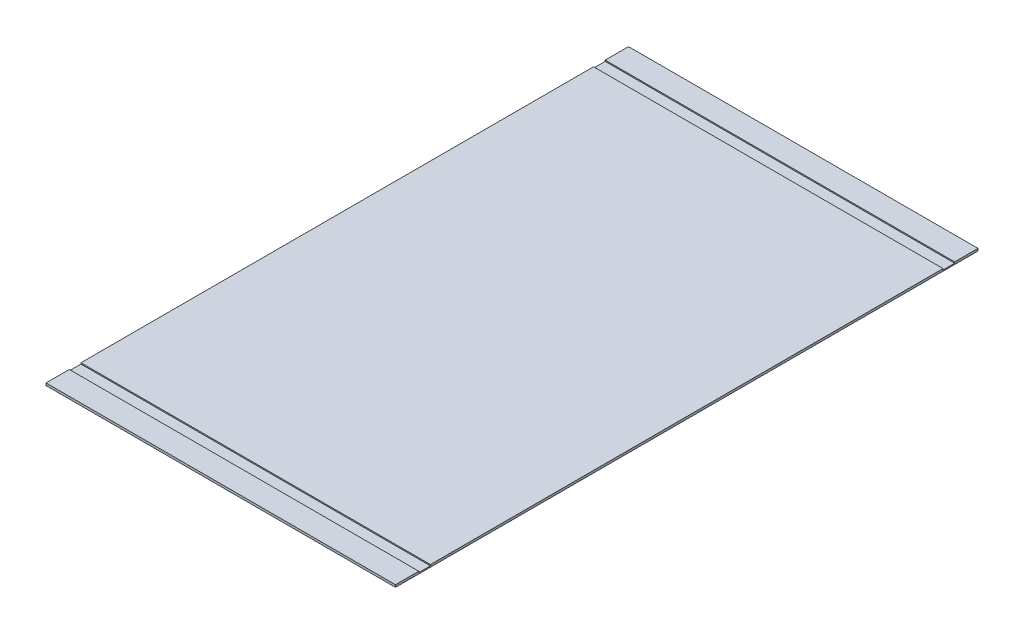
ISO-10303-21;
HEADER;
FILE_DESCRIPTION(('STEP AP214'),'2;1');
FILE_NAME('part.step','',(''),(''),'','','');
FILE_SCHEMA(('AUTOMOTIVE_DESIGN { 1 0 10303 214 1 1 1 1 }'));
ENDSEC;
DATA;
#1=APPLICATION_CONTEXT('core data for automotive mechanical design processes');
#2=APPLICATION_PROTOCOL_DEFINITION('international standard','automotive_design',2000,#1);
#3=PRODUCT_CONTEXT('',#1,'mechanical');
#4=PRODUCT('Part','Part','',(#3));
#5=PRODUCT_RELATED_PRODUCT_CATEGORY('part','',(#4));
#6=PRODUCT_DEFINITION_FORMATION('','',#4);
#7=PRODUCT_DEFINITION_CONTEXT('part definition',#1,'design');
#8=PRODUCT_DEFINITION('design','',#6,#7);
#9=PRODUCT_DEFINITION_SHAPE('','',#8);
#10=(LENGTH_UNIT() NAMED_UNIT(*) SI_UNIT(.MILLI.,.METRE.));
#11=(NAMED_UNIT(*) PLANE_ANGLE_UNIT() SI_UNIT($,.RADIAN.));
#12=(NAMED_UNIT(*) SI_UNIT($,.STERADIAN.) SOLID_ANGLE_UNIT());
#13=UNCERTAINTY_MEASURE_WITH_UNIT(LENGTH_MEASURE(1.E-05),#10,'distance_accuracy_value','');
#14=(GEOMETRIC_REPRESENTATION_CONTEXT(3) GLOBAL_UNCERTAINTY_ASSIGNED_CONTEXT((#13)) GLOBAL_UNIT_ASSIGNED_CONTEXT((#10,
#11,#12)) REPRESENTATION_CONTEXT('',''));
#15=CARTESIAN_POINT('',(0.,0.,0.));
#16=DIRECTION('',(0.,0.,1.));
#17=DIRECTION('',(1.,0.,0.));
#18=AXIS2_PLACEMENT_3D('',#15,#16,#17);
#19=CARTESIAN_POINT('',(0.,2.54,0.));
#20=DIRECTION('',(0.,1.,0.));
#21=DIRECTION('',(0.,0.,1.));
#22=AXIS2_PLACEMENT_3D('',#19,#20,#21);
#23=PLANE('',#22);
#24=DIRECTION('',(-1.,0.,0.));
#25=VECTOR('',#24,1.);
#26=CARTESIAN_POINT('',(0.,2.54,-609.6));
#27=LINE('',#26,#25);
#28=CARTESIAN_POINT('',(0.,2.54,-609.6));
#29=VERTEX_POINT('',#28);
#30=CARTESIAN_POINT('',(-381.,2.54,-609.6));
#31=VERTEX_POINT('',#30);
#32=EDGE_CURVE('E146',#29,#31,#27,.T.);
#33=ORIENTED_EDGE('',*,*,#32,.F.);
#34=DIRECTION('',(0.,0.,-1.));
#35=VECTOR('',#34,1.);
#36=CARTESIAN_POINT('',(0.,2.54,0.));
#37=LINE('',#36,#35);
#38=CARTESIAN_POINT('',(0.,2.54,-635.));
#39=VERTEX_POINT('',#38);
#40=EDGE_CURVE('E202',#29,#39,#37,.T.);
#41=ORIENTED_EDGE('',*,*,#40,.T.);
#42=DIRECTION('',(-1.,0.,0.));
#43=VECTOR('',#42,1.);
#44=CARTESIAN_POINT('',(0.,2.54,-635.));
#45=LINE('',#44,#43);
#46=CARTESIAN_POINT('',(-381.,2.54,-635.));
#47=VERTEX_POINT('',#46);
#48=EDGE_CURVE('E200',#39,#47,#45,.T.);
#49=ORIENTED_EDGE('',*,*,#48,.T.);
#50=DIRECTION('',(0.,0.,1.));
#51=VECTOR('',#50,1.);
#52=CARTESIAN_POINT('',(-381.,2.54,0.));
#53=LINE('',#52,#51);
#54=EDGE_CURVE('E206',#47,#31,#53,.T.);
#55=ORIENTED_EDGE('',*,*,#54,.T.);
#56=EDGE_LOOP('',(#33,#41,#49,#55));
#57=FACE_BOUND('',#56,.T.);
#58=ADVANCED_FACE('F39',(#57),#23,.T.);
#59=DIRECTION('',(1.,0.,0.));
#60=VECTOR('',#59,1.);
#61=CARTESIAN_POINT('',(0.,2.54,-25.4));
#62=LINE('',#61,#60);
#63=CARTESIAN_POINT('',(-381.,2.54,-25.3999999999999));
#64=VERTEX_POINT('',#63);
#65=CARTESIAN_POINT('',(0.,2.54,-25.4));
#66=VERTEX_POINT('',#65);
#67=EDGE_CURVE('E167',#64,#66,#62,.T.);
#68=ORIENTED_EDGE('',*,*,#67,.F.);
#69=CARTESIAN_POINT('',(-381.,2.54,0.));
#70=VERTEX_POINT('',#69);
#71=EDGE_CURVE('E205',#64,#70,#53,.T.);
#72=ORIENTED_EDGE('',*,*,#71,.T.);
#73=DIRECTION('',(1.,0.,0.));
#74=VECTOR('',#73,1.);
#75=CARTESIAN_POINT('',(0.,2.54,0.));
#76=LINE('',#75,#74);
#77=CARTESIAN_POINT('',(0.,2.54,0.));
#78=VERTEX_POINT('',#77);
#79=EDGE_CURVE('E210',#70,#78,#76,.T.);
#80=ORIENTED_EDGE('',*,*,#79,.T.);
#81=EDGE_CURVE('E196',#78,#66,#37,.T.);
#82=ORIENTED_EDGE('',*,*,#81,.T.);
#83=EDGE_LOOP('',(#68,#72,#80,#82));
#84=FACE_BOUND('',#83,.T.);
#85=ADVANCED_FACE('F257',(#84),#23,.T.);
#86=CARTESIAN_POINT('',(0.,2.54,0.));
#87=DIRECTION('',(-1.,0.,0.));
#88=DIRECTION('',(0.,0.,1.));
#89=AXIS2_PLACEMENT_3D('',#86,#87,#88);
#90=PLANE('',#89);
#91=ORIENTED_EDGE('',*,*,#40,.F.);
#92=DIRECTION('',(0.,1.,0.));
#93=VECTOR('',#92,1.);
#94=CARTESIAN_POINT('',(0.,1.27,-609.6));
#95=LINE('',#94,#93);
#96=CARTESIAN_POINT('',(0.,1.27,-609.6));
#97=VERTEX_POINT('',#96);
#98=EDGE_CURVE('E157',#97,#29,#95,.T.);
#99=ORIENTED_EDGE('',*,*,#98,.F.);
#100=DIRECTION('',(0.,0.,-1.));
#101=VECTOR('',#100,1.);
#102=CARTESIAN_POINT('',(0.,1.27,-596.9));
#103=LINE('',#102,#101);
#104=CARTESIAN_POINT('',(0.,1.27,-596.9));
#105=VERTEX_POINT('',#104);
#106=EDGE_CURVE('E135',#105,#97,#103,.T.);
#107=ORIENTED_EDGE('',*,*,#106,.F.);
#108=DIRECTION('',(0.,1.,0.));
#109=VECTOR('',#108,1.);
#110=CARTESIAN_POINT('',(0.,1.27,-596.9));
#111=LINE('',#110,#109);
#112=CARTESIAN_POINT('',(0.,2.54,-596.9));
#113=VERTEX_POINT('',#112);
#114=EDGE_CURVE('E131',#105,#113,#111,.T.);
#115=ORIENTED_EDGE('',*,*,#114,.T.);
#116=CARTESIAN_POINT('',(0.,2.54,-38.1));
#117=VERTEX_POINT('',#116);
#118=EDGE_CURVE('E201',#117,#113,#37,.T.);
#119=ORIENTED_EDGE('',*,*,#118,.F.);
#120=DIRECTION('',(0.,1.,0.));
#121=VECTOR('',#120,1.);
#122=CARTESIAN_POINT('',(0.,1.27,-38.1));
#123=LINE('',#122,#121);
#124=CARTESIAN_POINT('',(0.,1.27,-38.1));
#125=VERTEX_POINT('',#124);
#126=EDGE_CURVE('E63',#125,#117,#123,.T.);
#127=ORIENTED_EDGE('',*,*,#126,.F.);
#128=DIRECTION('',(0.,0.,-1.));
#129=VECTOR('',#128,1.);
#130=CARTESIAN_POINT('',(0.,1.27,-38.1));
#131=LINE('',#130,#129);
#132=CARTESIAN_POINT('',(0.,1.27,-25.4));
#133=VERTEX_POINT('',#132);
#134=EDGE_CURVE('E162',#133,#125,#131,.T.);
#135=ORIENTED_EDGE('',*,*,#134,.F.);
#136=DIRECTION('',(0.,1.,0.));
#137=VECTOR('',#136,1.);
#138=CARTESIAN_POINT('',(0.,1.27,-25.4));
#139=LINE('',#138,#137);
#140=EDGE_CURVE('E183',#133,#66,#139,.T.);
#141=ORIENTED_EDGE('',*,*,#140,.T.);
#142=ORIENTED_EDGE('',*,*,#81,.F.);
#143=DIRECTION('',(0.,-1.,0.));
#144=VECTOR('',#143,1.);
#145=CARTESIAN_POINT('',(0.,2.54,0.));
#146=LINE('',#145,#144);
#147=CARTESIAN_POINT('',(0.,0.,0.));
#148=VERTEX_POINT('',#147);
#149=EDGE_CURVE('E213',#78,#148,#146,.T.);
#150=ORIENTED_EDGE('',*,*,#149,.T.);
#151=DIRECTION('',(0.,0.,-1.));
#152=VECTOR('',#151,1.);
#153=CARTESIAN_POINT('',(0.,0.,0.));
#154=LINE('',#153,#152);
#155=CARTESIAN_POINT('',(0.,0.,-635.));
#156=VERTEX_POINT('',#155);
#157=EDGE_CURVE('E214',#148,#156,#154,.T.);
#158=ORIENTED_EDGE('',*,*,#157,.T.);
#159=DIRECTION('',(0.,-1.,0.));
#160=VECTOR('',#159,1.);
#161=CARTESIAN_POINT('',(0.,2.54,-635.));
#162=LINE('',#161,#160);
#163=EDGE_CURVE('E11',#39,#156,#162,.T.);
#164=ORIENTED_EDGE('',*,*,#163,.F.);
#165=EDGE_LOOP('',(#91,#99,#107,#115,#119,#127,#135,#141,#142,#150,#158,#164));
#166=FACE_BOUND('',#165,.T.);
#167=ADVANCED_FACE('F41',(#166),#90,.F.);
#168=CARTESIAN_POINT('',(0.,2.54,-635.));
#169=DIRECTION('',(0.,0.,1.));
#170=DIRECTION('',(1.,0.,0.));
#171=AXIS2_PLACEMENT_3D('',#168,#169,#170);
#172=PLANE('',#171);
#173=DIRECTION('',(-1.,0.,0.));
#174=VECTOR('',#173,1.);
#175=CARTESIAN_POINT('',(0.,0.,-635.));
#176=LINE('',#175,#174);
#177=CARTESIAN_POINT('',(-381.,0.,-635.));
#178=VERTEX_POINT('',#177);
#179=EDGE_CURVE('E218',#156,#178,#176,.T.);
#180=ORIENTED_EDGE('',*,*,#179,.T.);
#181=DIRECTION('',(0.,-1.,0.));
#182=VECTOR('',#181,1.);
#183=CARTESIAN_POINT('',(-381.,2.54,-635.));
#184=LINE('',#183,#182);
#185=EDGE_CURVE('E48',#47,#178,#184,.T.);
#186=ORIENTED_EDGE('',*,*,#185,.F.);
#187=ORIENTED_EDGE('',*,*,#48,.F.);
#188=ORIENTED_EDGE('',*,*,#163,.T.);
#189=EDGE_LOOP('',(#180,#186,#187,#188));
#190=FACE_BOUND('',#189,.T.);
#191=ADVANCED_FACE('F281',(#190),#172,.F.);
#192=CARTESIAN_POINT('',(-381.,2.54,0.));
#193=DIRECTION('',(1.,0.,0.));
#194=DIRECTION('',(0.,0.,-1.));
#195=AXIS2_PLACEMENT_3D('',#192,#193,#194);
#196=PLANE('',#195);
#197=DIRECTION('',(0.,0.,1.));
#198=VECTOR('',#197,1.);
#199=CARTESIAN_POINT('',(-381.,1.27,-609.6));
#200=LINE('',#199,#198);
#201=CARTESIAN_POINT('',(-381.,1.27,-609.6));
#202=VERTEX_POINT('',#201);
#203=CARTESIAN_POINT('',(-381.,1.27,-596.9));
#204=VERTEX_POINT('',#203);
#205=EDGE_CURVE('E136',#202,#204,#200,.T.);
#206=ORIENTED_EDGE('',*,*,#205,.F.);
#207=DIRECTION('',(0.,1.,0.));
#208=VECTOR('',#207,1.);
#209=CARTESIAN_POINT('',(-381.,1.27,-609.6));
#210=LINE('',#209,#208);
#211=EDGE_CURVE('E219',#202,#31,#210,.T.);
#212=ORIENTED_EDGE('',*,*,#211,.T.);
#213=ORIENTED_EDGE('',*,*,#54,.F.);
#214=ORIENTED_EDGE('',*,*,#185,.T.);
#215=DIRECTION('',(0.,0.,1.));
#216=VECTOR('',#215,1.);
#217=CARTESIAN_POINT('',(-381.,0.,0.));
#218=LINE('',#217,#216);
#219=CARTESIAN_POINT('',(-381.,0.,0.));
#220=VERTEX_POINT('',#219);
#221=EDGE_CURVE('E222',#178,#220,#218,.T.);
#222=ORIENTED_EDGE('',*,*,#221,.T.);
#223=DIRECTION('',(0.,-1.,0.));
#224=VECTOR('',#223,1.);
#225=CARTESIAN_POINT('',(-381.,2.54,0.));
#226=LINE('',#225,#224);
#227=EDGE_CURVE('E231',#70,#220,#226,.T.);
#228=ORIENTED_EDGE('',*,*,#227,.F.);
#229=ORIENTED_EDGE('',*,*,#71,.F.);
#230=DIRECTION('',(0.,1.,0.));
#231=VECTOR('',#230,1.);
#232=CARTESIAN_POINT('',(-381.,1.27,-25.3999999999999));
#233=LINE('',#232,#231);
#234=CARTESIAN_POINT('',(-381.,1.27,-25.3999999999999));
#235=VERTEX_POINT('',#234);
#236=EDGE_CURVE('E188',#235,#64,#233,.T.);
#237=ORIENTED_EDGE('',*,*,#236,.F.);
#238=DIRECTION('',(0.,0.,1.));
#239=VECTOR('',#238,1.);
#240=CARTESIAN_POINT('',(-381.,1.27,-25.3999999999999));
#241=LINE('',#240,#239);
#242=CARTESIAN_POINT('',(-381.,1.27,-38.1));
#243=VERTEX_POINT('',#242);
#244=EDGE_CURVE('E171',#243,#235,#241,.T.);
#245=ORIENTED_EDGE('',*,*,#244,.F.);
#246=DIRECTION('',(0.,1.,0.));
#247=VECTOR('',#246,1.);
#248=CARTESIAN_POINT('',(-381.,1.27,-38.1));
#249=LINE('',#248,#247);
#250=CARTESIAN_POINT('',(-381.,2.54,-38.1));
#251=VERTEX_POINT('',#250);
#252=EDGE_CURVE('E191',#243,#251,#249,.T.);
#253=ORIENTED_EDGE('',*,*,#252,.T.);
#254=CARTESIAN_POINT('',(-381.,2.54,-596.9));
#255=VERTEX_POINT('',#254);
#256=EDGE_CURVE('E152',#255,#251,#53,.T.);
#257=ORIENTED_EDGE('',*,*,#256,.F.);
#258=DIRECTION('',(0.,1.,0.));
#259=VECTOR('',#258,1.);
#260=CARTESIAN_POINT('',(-381.,1.27,-596.9));
#261=LINE('',#260,#259);
#262=EDGE_CURVE('E55',#204,#255,#261,.T.);
#263=ORIENTED_EDGE('',*,*,#262,.F.);
#264=EDGE_LOOP('',(#206,#212,#213,#214,#222,#228,#229,#237,#245,#253,#257,#263));
#265=FACE_BOUND('',#264,.T.);
#266=ADVANCED_FACE('F149',(#265),#196,.F.);
#267=CARTESIAN_POINT('',(0.,2.54,0.));
#268=DIRECTION('',(0.,0.,-1.));
#269=DIRECTION('',(-1.,0.,0.));
#270=AXIS2_PLACEMENT_3D('',#267,#268,#269);
#271=PLANE('',#270);
#272=DIRECTION('',(1.,0.,0.));
#273=VECTOR('',#272,1.);
#274=CARTESIAN_POINT('',(0.,0.,0.));
#275=LINE('',#274,#273);
#276=EDGE_CURVE('E225',#220,#148,#275,.T.);
#277=ORIENTED_EDGE('',*,*,#276,.T.);
#278=ORIENTED_EDGE('',*,*,#149,.F.);
#279=ORIENTED_EDGE('',*,*,#79,.F.);
#280=ORIENTED_EDGE('',*,*,#227,.T.);
#281=EDGE_LOOP('',(#277,#278,#279,#280));
#282=FACE_BOUND('',#281,.T.);
#283=ADVANCED_FACE('F248',(#282),#271,.F.);
#284=DIRECTION('',(1.,0.,0.));
#285=VECTOR('',#284,1.);
#286=CARTESIAN_POINT('',(-381.,2.54,-596.9));
#287=LINE('',#286,#285);
#288=EDGE_CURVE('E187',#255,#113,#287,.T.);
#289=ORIENTED_EDGE('',*,*,#288,.F.);
#290=ORIENTED_EDGE('',*,*,#256,.T.);
#291=DIRECTION('',(-1.,0.,0.));
#292=VECTOR('',#291,1.);
#293=CARTESIAN_POINT('',(-381.,2.54,-38.1));
#294=LINE('',#293,#292);
#295=EDGE_CURVE('E178',#117,#251,#294,.T.);
#296=ORIENTED_EDGE('',*,*,#295,.F.);
#297=ORIENTED_EDGE('',*,*,#118,.T.);
#298=EDGE_LOOP('',(#289,#290,#296,#297));
#299=FACE_BOUND('',#298,.T.);
#300=ADVANCED_FACE('F263',(#299),#23,.T.);
#301=CARTESIAN_POINT('',(0.,0.,0.));
#302=DIRECTION('',(0.,1.,0.));
#303=DIRECTION('',(0.,0.,1.));
#304=AXIS2_PLACEMENT_3D('',#301,#302,#303);
#305=PLANE('',#304);
#306=ORIENTED_EDGE('',*,*,#157,.F.);
#307=ORIENTED_EDGE('',*,*,#276,.F.);
#308=ORIENTED_EDGE('',*,*,#221,.F.);
#309=ORIENTED_EDGE('',*,*,#179,.F.);
#310=EDGE_LOOP('',(#306,#307,#308,#309));
#311=FACE_BOUND('',#310,.T.);
#312=ADVANCED_FACE('F245',(#311),#305,.F.);
#313=CARTESIAN_POINT('',(0.,1.27,-25.4));
#314=DIRECTION('',(0.,0.,1.));
#315=DIRECTION('',(1.,0.,0.));
#316=AXIS2_PLACEMENT_3D('',#313,#314,#315);
#317=PLANE('',#316);
#318=ORIENTED_EDGE('',*,*,#67,.T.);
#319=ORIENTED_EDGE('',*,*,#140,.F.);
#320=DIRECTION('',(1.,0.,0.));
#321=VECTOR('',#320,1.);
#322=CARTESIAN_POINT('',(0.,1.27,-25.4));
#323=LINE('',#322,#321);
#324=EDGE_CURVE('E174',#235,#133,#323,.T.);
#325=ORIENTED_EDGE('',*,*,#324,.F.);
#326=ORIENTED_EDGE('',*,*,#236,.T.);
#327=EDGE_LOOP('',(#318,#319,#325,#326));
#328=FACE_BOUND('',#327,.T.);
#329=ADVANCED_FACE('F300',(#328),#317,.F.);
#330=CARTESIAN_POINT('',(-381.,1.27,-38.1));
#331=DIRECTION('',(0.,0.,-1.));
#332=DIRECTION('',(-1.,0.,0.));
#333=AXIS2_PLACEMENT_3D('',#330,#331,#332);
#334=PLANE('',#333);
#335=ORIENTED_EDGE('',*,*,#295,.T.);
#336=ORIENTED_EDGE('',*,*,#252,.F.);
#337=DIRECTION('',(-1.,0.,0.));
#338=VECTOR('',#337,1.);
#339=CARTESIAN_POINT('',(-381.,1.27,-38.1));
#340=LINE('',#339,#338);
#341=EDGE_CURVE('E166',#125,#243,#340,.T.);
#342=ORIENTED_EDGE('',*,*,#341,.F.);
#343=ORIENTED_EDGE('',*,*,#126,.T.);
#344=EDGE_LOOP('',(#335,#336,#342,#343));
#345=FACE_BOUND('',#344,.T.);
#346=ADVANCED_FACE('F328',(#345),#334,.F.);
#347=CARTESIAN_POINT('',(0.,1.27,0.));
#348=DIRECTION('',(0.,-1.,0.));
#349=DIRECTION('',(0.,0.,-1.));
#350=AXIS2_PLACEMENT_3D('',#347,#348,#349);
#351=PLANE('',#350);
#352=ORIENTED_EDGE('',*,*,#134,.T.);
#353=ORIENTED_EDGE('',*,*,#341,.T.);
#354=ORIENTED_EDGE('',*,*,#244,.T.);
#355=ORIENTED_EDGE('',*,*,#324,.T.);
#356=EDGE_LOOP('',(#352,#353,#354,#355));
#357=FACE_BOUND('',#356,.T.);
#358=ADVANCED_FACE('F339',(#357),#351,.F.);
#359=CARTESIAN_POINT('',(0.,1.27,-609.6));
#360=DIRECTION('',(0.,0.,-1.));
#361=DIRECTION('',(-1.,0.,0.));
#362=AXIS2_PLACEMENT_3D('',#359,#360,#361);
#363=PLANE('',#362);
#364=ORIENTED_EDGE('',*,*,#32,.T.);
#365=ORIENTED_EDGE('',*,*,#211,.F.);
#366=DIRECTION('',(-1.,0.,0.));
#367=VECTOR('',#366,1.);
#368=CARTESIAN_POINT('',(0.,1.27,-609.6));
#369=LINE('',#368,#367);
#370=EDGE_CURVE('E142',#97,#202,#369,.T.);
#371=ORIENTED_EDGE('',*,*,#370,.F.);
#372=ORIENTED_EDGE('',*,*,#98,.T.);
#373=EDGE_LOOP('',(#364,#365,#371,#372));
#374=FACE_BOUND('',#373,.T.);
#375=ADVANCED_FACE('F277',(#374),#363,.F.);
#376=CARTESIAN_POINT('',(-381.,1.27,-596.9));
#377=DIRECTION('',(0.,0.,1.));
#378=DIRECTION('',(1.,0.,0.));
#379=AXIS2_PLACEMENT_3D('',#376,#377,#378);
#380=PLANE('',#379);
#381=ORIENTED_EDGE('',*,*,#288,.T.);
#382=ORIENTED_EDGE('',*,*,#114,.F.);
#383=DIRECTION('',(1.,0.,0.));
#384=VECTOR('',#383,1.);
#385=CARTESIAN_POINT('',(-381.,1.27,-596.9));
#386=LINE('',#385,#384);
#387=EDGE_CURVE('E127',#204,#105,#386,.T.);
#388=ORIENTED_EDGE('',*,*,#387,.F.);
#389=ORIENTED_EDGE('',*,*,#262,.T.);
#390=EDGE_LOOP('',(#381,#382,#388,#389));
#391=FACE_BOUND('',#390,.T.);
#392=ADVANCED_FACE('F129',(#391),#380,.F.);
#393=CARTESIAN_POINT('',(0.,1.27,0.));
#394=DIRECTION('',(0.,1.,0.));
#395=DIRECTION('',(0.,0.,1.));
#396=AXIS2_PLACEMENT_3D('',#393,#394,#395);
#397=PLANE('',#396);
#398=ORIENTED_EDGE('',*,*,#205,.T.);
#399=ORIENTED_EDGE('',*,*,#387,.T.);
#400=ORIENTED_EDGE('',*,*,#106,.T.);
#401=ORIENTED_EDGE('',*,*,#370,.T.);
#402=EDGE_LOOP('',(#398,#399,#400,#401));
#403=FACE_BOUND('',#402,.T.);
#404=ADVANCED_FACE('F140',(#403),#397,.T.);
#405=CLOSED_SHELL('',(#58,#85,#167,#191,#266,#283,#300,#312,#329,#346,#358,#375,#392,#404));
#406=MANIFOLD_SOLID_BREP('B2',#405);
#407=ADVANCED_BREP_SHAPE_REPRESENTATION('',(#18,#406),#14);
#408=SHAPE_DEFINITION_REPRESENTATION(#9,#407);
ENDSEC;
END-ISO-10303-21;
